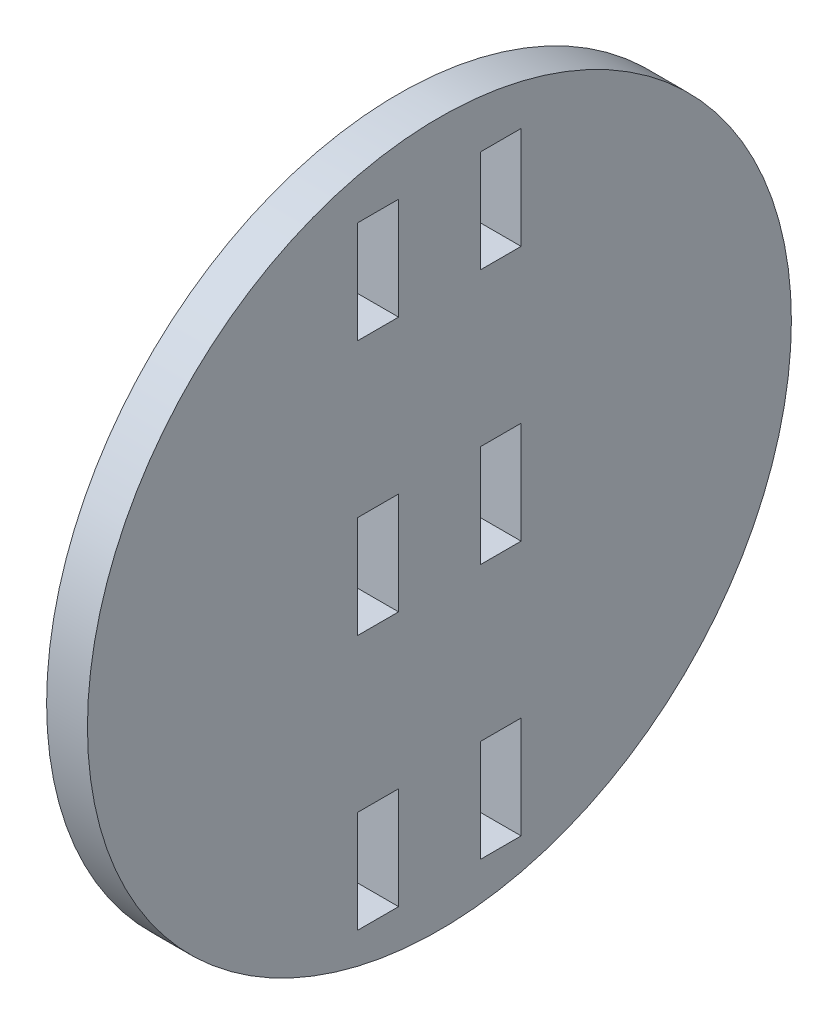
ISO-10303-21;
HEADER;
FILE_DESCRIPTION(('STEP AP214'),'2;1');
FILE_NAME('part.step','',(''),(''),'','','');
FILE_SCHEMA(('AUTOMOTIVE_DESIGN { 1 0 10303 214 1 1 1 1 }'));
ENDSEC;
DATA;
#1=APPLICATION_CONTEXT('core data for automotive mechanical design processes');
#2=APPLICATION_PROTOCOL_DEFINITION('international standard','automotive_design',2000,#1);
#3=PRODUCT_CONTEXT('',#1,'mechanical');
#4=PRODUCT('Part','Part','',(#3));
#5=PRODUCT_RELATED_PRODUCT_CATEGORY('part','',(#4));
#6=PRODUCT_DEFINITION_FORMATION('','',#4);
#7=PRODUCT_DEFINITION_CONTEXT('part definition',#1,'design');
#8=PRODUCT_DEFINITION('design','',#6,#7);
#9=PRODUCT_DEFINITION_SHAPE('','',#8);
#10=(LENGTH_UNIT() NAMED_UNIT(*) SI_UNIT(.MILLI.,.METRE.));
#11=(NAMED_UNIT(*) PLANE_ANGLE_UNIT() SI_UNIT($,.RADIAN.));
#12=(NAMED_UNIT(*) SI_UNIT($,.STERADIAN.) SOLID_ANGLE_UNIT());
#13=UNCERTAINTY_MEASURE_WITH_UNIT(LENGTH_MEASURE(1.E-05),#10,'distance_accuracy_value','');
#14=(GEOMETRIC_REPRESENTATION_CONTEXT(3) GLOBAL_UNCERTAINTY_ASSIGNED_CONTEXT((#13)) GLOBAL_UNIT_ASSIGNED_CONTEXT((#10,
#11,#12)) REPRESENTATION_CONTEXT('',''));
#15=CARTESIAN_POINT('',(0.,0.,0.));
#16=DIRECTION('',(0.,0.,1.));
#17=DIRECTION('',(1.,0.,0.));
#18=AXIS2_PLACEMENT_3D('',#15,#16,#17);
#19=CARTESIAN_POINT('',(2.,0.,0.));
#20=DIRECTION('',(1.,0.,0.));
#21=DIRECTION('',(0.,0.,-1.));
#22=AXIS2_PLACEMENT_3D('',#19,#20,#21);
#23=PLANE('',#22);
#24=DIRECTION('',(0.,1.,0.));
#25=VECTOR('',#24,1.);
#26=CARTESIAN_POINT('',(2.,29.5294117647059,-8.));
#27=LINE('',#26,#25);
#28=CARTESIAN_POINT('',(2.,19.5294117647059,-8.));
#29=VERTEX_POINT('',#28);
#30=CARTESIAN_POINT('',(2.,29.5294117647059,-8.));
#31=VERTEX_POINT('',#30);
#32=EDGE_CURVE('E312',#29,#31,#27,.T.);
#33=ORIENTED_EDGE('',*,*,#32,.F.);
#34=DIRECTION('',(0.,0.,-1.));
#35=VECTOR('',#34,1.);
#36=CARTESIAN_POINT('',(2.,19.5294117647059,-8.));
#37=LINE('',#36,#35);
#38=CARTESIAN_POINT('',(2.,19.5294117647059,-4.));
#39=VERTEX_POINT('',#38);
#40=EDGE_CURVE('E302',#39,#29,#37,.T.);
#41=ORIENTED_EDGE('',*,*,#40,.F.);
#42=DIRECTION('',(0.,-1.,0.));
#43=VECTOR('',#42,1.);
#44=CARTESIAN_POINT('',(2.,29.5294117647059,-4.));
#45=LINE('',#44,#43);
#46=CARTESIAN_POINT('',(2.,29.5294117647059,-4.));
#47=VERTEX_POINT('',#46);
#48=EDGE_CURVE('E318',#47,#39,#45,.T.);
#49=ORIENTED_EDGE('',*,*,#48,.F.);
#50=DIRECTION('',(0.,0.,1.));
#51=VECTOR('',#50,1.);
#52=CARTESIAN_POINT('',(2.,29.5294117647059,-8.));
#53=LINE('',#52,#51);
#54=EDGE_CURVE('E314',#31,#47,#53,.T.);
#55=ORIENTED_EDGE('',*,*,#54,.F.);
#56=EDGE_LOOP('',(#33,#41,#49,#55));
#57=FACE_BOUND('',#56,.T.);
#58=DIRECTION('',(0.,0.,1.));
#59=VECTOR('',#58,1.);
#60=CARTESIAN_POINT('',(2.,4.5294117647059,-8.00000000000026));
#61=LINE('',#60,#59);
#62=CARTESIAN_POINT('',(2.,4.5294117647059,-8.00000000000026));
#63=VERTEX_POINT('',#62);
#64=CARTESIAN_POINT('',(2.,4.5294117647059,-4.00000000000026));
#65=VERTEX_POINT('',#64);
#66=EDGE_CURVE('E315',#63,#65,#61,.T.);
#67=ORIENTED_EDGE('',*,*,#66,.F.);
#68=DIRECTION('',(0.,1.,0.));
#69=VECTOR('',#68,1.);
#70=CARTESIAN_POINT('',(2.,4.5294117647059,-8.00000000000026));
#71=LINE('',#70,#69);
#72=CARTESIAN_POINT('',(2.,-5.4705882352941,-8.00000000000026));
#73=VERTEX_POINT('',#72);
#74=EDGE_CURVE('E342',#73,#63,#71,.T.);
#75=ORIENTED_EDGE('',*,*,#74,.F.);
#76=DIRECTION('',(0.,0.,-1.));
#77=VECTOR('',#76,1.);
#78=CARTESIAN_POINT('',(2.,-5.4705882352941,-8.00000000000026));
#79=LINE('',#78,#77);
#80=CARTESIAN_POINT('',(2.,-5.4705882352941,-4.00000000000026));
#81=VERTEX_POINT('',#80);
#82=EDGE_CURVE('E345',#81,#73,#79,.T.);
#83=ORIENTED_EDGE('',*,*,#82,.F.);
#84=DIRECTION('',(0.,-1.,0.));
#85=VECTOR('',#84,1.);
#86=CARTESIAN_POINT('',(2.,4.5294117647059,-4.00000000000026));
#87=LINE('',#86,#85);
#88=EDGE_CURVE('E349',#65,#81,#87,.T.);
#89=ORIENTED_EDGE('',*,*,#88,.F.);
#90=EDGE_LOOP('',(#67,#75,#83,#89));
#91=FACE_BOUND('',#90,.T.);
#92=DIRECTION('',(0.,0.,1.));
#93=VECTOR('',#92,1.);
#94=CARTESIAN_POINT('',(2.,-20.4705882352941,-8.00000000000052));
#95=LINE('',#94,#93);
#96=CARTESIAN_POINT('',(2.,-20.4705882352941,-8.00000000000052));
#97=VERTEX_POINT('',#96);
#98=CARTESIAN_POINT('',(2.,-20.4705882352941,-4.00000000000052));
#99=VERTEX_POINT('',#98);
#100=EDGE_CURVE('E341',#97,#99,#95,.T.);
#101=ORIENTED_EDGE('',*,*,#100,.F.);
#102=DIRECTION('',(0.,1.,0.));
#103=VECTOR('',#102,1.);
#104=CARTESIAN_POINT('',(2.,-20.4705882352941,-8.00000000000052));
#105=LINE('',#104,#103);
#106=CARTESIAN_POINT('',(2.,-30.4705882352941,-7.99999999999999));
#107=VERTEX_POINT('',#106);
#108=EDGE_CURVE('E372',#107,#97,#105,.T.);
#109=ORIENTED_EDGE('',*,*,#108,.F.);
#110=DIRECTION('',(0.,0.,-1.));
#111=VECTOR('',#110,1.);
#112=CARTESIAN_POINT('',(2.,-30.4705882352941,-7.99999999999999));
#113=LINE('',#112,#111);
#114=CARTESIAN_POINT('',(2.,-30.4705882352941,-3.99999999999999));
#115=VERTEX_POINT('',#114);
#116=EDGE_CURVE('E375',#115,#107,#113,.T.);
#117=ORIENTED_EDGE('',*,*,#116,.F.);
#118=DIRECTION('',(0.,-1.,0.));
#119=VECTOR('',#118,1.);
#120=CARTESIAN_POINT('',(2.,-20.4705882352941,-4.00000000000052));
#121=LINE('',#120,#119);
#122=EDGE_CURVE('E379',#99,#115,#121,.T.);
#123=ORIENTED_EDGE('',*,*,#122,.F.);
#124=EDGE_LOOP('',(#101,#109,#117,#123));
#125=FACE_BOUND('',#124,.T.);
#126=CARTESIAN_POINT('',(2.,0.,0.));
#127=DIRECTION('',(1.,0.,0.));
#128=DIRECTION('',(0.,0.,-1.));
#129=AXIS2_PLACEMENT_3D('',#126,#127,#128);
#130=CIRCLE('',#129,34.4705882352941);
#131=CARTESIAN_POINT('',(2.,0.,-34.4705882352941));
#132=VERTEX_POINT('',#131);
#133=EDGE_CURVE('E11',#132,#132,#130,.T.);
#134=ORIENTED_EDGE('',*,*,#133,.T.);
#135=EDGE_LOOP('',(#134));
#136=FACE_BOUND('',#135,.T.);
#137=DIRECTION('',(0.,1.,0.));
#138=VECTOR('',#137,1.);
#139=CARTESIAN_POINT('',(2.,-20.4705882352941,8.00000000000052));
#140=LINE('',#139,#138);
#141=CARTESIAN_POINT('',(2.,-30.4705882352941,7.99999999999999));
#142=VERTEX_POINT('',#141);
#143=CARTESIAN_POINT('',(2.,-20.4705882352941,8.00000000000052));
#144=VERTEX_POINT('',#143);
#145=EDGE_CURVE('E282',#142,#144,#140,.T.);
#146=ORIENTED_EDGE('',*,*,#145,.T.);
#147=DIRECTION('',(0.,0.,-1.));
#148=VECTOR('',#147,1.);
#149=CARTESIAN_POINT('',(2.,-20.4705882352941,8.00000000000052));
#150=LINE('',#149,#148);
#151=CARTESIAN_POINT('',(2.,-20.4705882352941,4.00000000000052));
#152=VERTEX_POINT('',#151);
#153=EDGE_CURVE('E279',#144,#152,#150,.T.);
#154=ORIENTED_EDGE('',*,*,#153,.T.);
#155=DIRECTION('',(0.,-1.,0.));
#156=VECTOR('',#155,1.);
#157=CARTESIAN_POINT('',(2.,-20.4705882352941,4.00000000000052));
#158=LINE('',#157,#156);
#159=CARTESIAN_POINT('',(2.,-30.4705882352941,3.99999999999999));
#160=VERTEX_POINT('',#159);
#161=EDGE_CURVE('E271',#152,#160,#158,.T.);
#162=ORIENTED_EDGE('',*,*,#161,.T.);
#163=DIRECTION('',(0.,0.,1.));
#164=VECTOR('',#163,1.);
#165=CARTESIAN_POINT('',(2.,-30.4705882352941,7.99999999999999));
#166=LINE('',#165,#164);
#167=EDGE_CURVE('E285',#160,#142,#166,.T.);
#168=ORIENTED_EDGE('',*,*,#167,.T.);
#169=EDGE_LOOP('',(#146,#154,#162,#168));
#170=FACE_BOUND('',#169,.T.);
#171=DIRECTION('',(0.,1.,0.));
#172=VECTOR('',#171,1.);
#173=CARTESIAN_POINT('',(2.,4.5294117647059,8.00000000000026));
#174=LINE('',#173,#172);
#175=CARTESIAN_POINT('',(2.,-5.4705882352941,8.00000000000026));
#176=VERTEX_POINT('',#175);
#177=CARTESIAN_POINT('',(2.,4.5294117647059,8.00000000000026));
#178=VERTEX_POINT('',#177);
#179=EDGE_CURVE('E253',#176,#178,#174,.T.);
#180=ORIENTED_EDGE('',*,*,#179,.T.);
#181=DIRECTION('',(0.,0.,-1.));
#182=VECTOR('',#181,1.);
#183=CARTESIAN_POINT('',(2.,4.5294117647059,8.00000000000026));
#184=LINE('',#183,#182);
#185=CARTESIAN_POINT('',(2.,4.5294117647059,4.00000000000026));
#186=VERTEX_POINT('',#185);
#187=EDGE_CURVE('E61',#178,#186,#184,.T.);
#188=ORIENTED_EDGE('',*,*,#187,.T.);
#189=DIRECTION('',(0.,-1.,0.));
#190=VECTOR('',#189,1.);
#191=CARTESIAN_POINT('',(2.,4.5294117647059,4.00000000000026));
#192=LINE('',#191,#190);
#193=CARTESIAN_POINT('',(2.,-5.4705882352941,4.00000000000026));
#194=VERTEX_POINT('',#193);
#195=EDGE_CURVE('E244',#186,#194,#192,.T.);
#196=ORIENTED_EDGE('',*,*,#195,.T.);
#197=DIRECTION('',(0.,0.,1.));
#198=VECTOR('',#197,1.);
#199=CARTESIAN_POINT('',(2.,-5.4705882352941,8.00000000000026));
#200=LINE('',#199,#198);
#201=EDGE_CURVE('E257',#194,#176,#200,.T.);
#202=ORIENTED_EDGE('',*,*,#201,.T.);
#203=EDGE_LOOP('',(#180,#188,#196,#202));
#204=FACE_BOUND('',#203,.T.);
#205=DIRECTION('',(0.,0.,1.));
#206=VECTOR('',#205,1.);
#207=CARTESIAN_POINT('',(2.,19.5294117647059,8.));
#208=LINE('',#207,#206);
#209=CARTESIAN_POINT('',(2.,19.5294117647059,4.));
#210=VERTEX_POINT('',#209);
#211=CARTESIAN_POINT('',(2.,19.5294117647059,8.));
#212=VERTEX_POINT('',#211);
#213=EDGE_CURVE('E230',#210,#212,#208,.T.);
#214=ORIENTED_EDGE('',*,*,#213,.T.);
#215=DIRECTION('',(0.,1.,0.));
#216=VECTOR('',#215,1.);
#217=CARTESIAN_POINT('',(2.,29.5294117647059,8.));
#218=LINE('',#217,#216);
#219=CARTESIAN_POINT('',(2.,29.5294117647059,8.));
#220=VERTEX_POINT('',#219);
#221=EDGE_CURVE('E53',#212,#220,#218,.T.);
#222=ORIENTED_EDGE('',*,*,#221,.T.);
#223=DIRECTION('',(0.,0.,-1.));
#224=VECTOR('',#223,1.);
#225=CARTESIAN_POINT('',(2.,29.5294117647059,8.));
#226=LINE('',#225,#224);
#227=CARTESIAN_POINT('',(2.,29.5294117647059,4.));
#228=VERTEX_POINT('',#227);
#229=EDGE_CURVE('E221',#220,#228,#226,.T.);
#230=ORIENTED_EDGE('',*,*,#229,.T.);
#231=DIRECTION('',(0.,-1.,0.));
#232=VECTOR('',#231,1.);
#233=CARTESIAN_POINT('',(2.,29.5294117647059,4.));
#234=LINE('',#233,#232);
#235=EDGE_CURVE('E224',#228,#210,#234,.T.);
#236=ORIENTED_EDGE('',*,*,#235,.T.);
#237=EDGE_LOOP('',(#214,#222,#230,#236));
#238=FACE_BOUND('',#237,.T.);
#239=ADVANCED_FACE('F38',(#57,#91,#125,#136,#170,#204,#238),#23,.T.);
#240=CARTESIAN_POINT('',(-2.,0.,0.));
#241=DIRECTION('',(1.,0.,0.));
#242=DIRECTION('',(0.,0.,-1.));
#243=AXIS2_PLACEMENT_3D('',#240,#241,#242);
#244=PLANE('',#243);
#245=DIRECTION('',(0.,0.,-1.));
#246=VECTOR('',#245,1.);
#247=CARTESIAN_POINT('',(-2.,4.5294117647059,8.00000000000026));
#248=LINE('',#247,#246);
#249=CARTESIAN_POINT('',(-2.,4.5294117647059,8.00000000000026));
#250=VERTEX_POINT('',#249);
#251=CARTESIAN_POINT('',(-2.,4.5294117647059,4.00000000000026));
#252=VERTEX_POINT('',#251);
#253=EDGE_CURVE('E241',#250,#252,#248,.T.);
#254=ORIENTED_EDGE('',*,*,#253,.F.);
#255=DIRECTION('',(0.,1.,0.));
#256=VECTOR('',#255,1.);
#257=CARTESIAN_POINT('',(-2.,4.5294117647059,8.00000000000026));
#258=LINE('',#257,#256);
#259=CARTESIAN_POINT('',(-2.,-5.4705882352941,8.00000000000026));
#260=VERTEX_POINT('',#259);
#261=EDGE_CURVE('E243',#260,#250,#258,.T.);
#262=ORIENTED_EDGE('',*,*,#261,.F.);
#263=DIRECTION('',(0.,0.,1.));
#264=VECTOR('',#263,1.);
#265=CARTESIAN_POINT('',(-2.,-5.4705882352941,8.00000000000026));
#266=LINE('',#265,#264);
#267=CARTESIAN_POINT('',(-2.,-5.4705882352941,4.00000000000026));
#268=VERTEX_POINT('',#267);
#269=EDGE_CURVE('E246',#268,#260,#266,.T.);
#270=ORIENTED_EDGE('',*,*,#269,.F.);
#271=DIRECTION('',(0.,-1.,0.));
#272=VECTOR('',#271,1.);
#273=CARTESIAN_POINT('',(-2.,4.5294117647059,4.00000000000026));
#274=LINE('',#273,#272);
#275=EDGE_CURVE('E249',#252,#268,#274,.T.);
#276=ORIENTED_EDGE('',*,*,#275,.F.);
#277=EDGE_LOOP('',(#254,#262,#270,#276));
#278=FACE_BOUND('',#277,.T.);
#279=CARTESIAN_POINT('',(-2.,0.,0.));
#280=DIRECTION('',(1.,0.,0.));
#281=DIRECTION('',(0.,0.,-1.));
#282=AXIS2_PLACEMENT_3D('',#279,#280,#281);
#283=CIRCLE('',#282,34.4705882352941);
#284=CARTESIAN_POINT('',(-2.,0.,-34.4705882352941));
#285=VERTEX_POINT('',#284);
#286=EDGE_CURVE('E42',#285,#285,#283,.T.);
#287=ORIENTED_EDGE('',*,*,#286,.F.);
#288=EDGE_LOOP('',(#287));
#289=FACE_BOUND('',#288,.T.);
#290=DIRECTION('',(0.,1.,0.));
#291=VECTOR('',#290,1.);
#292=CARTESIAN_POINT('',(-2.,-20.4705882352941,-8.00000000000052));
#293=LINE('',#292,#291);
#294=CARTESIAN_POINT('',(-2.,-30.4705882352941,-7.99999999999999));
#295=VERTEX_POINT('',#294);
#296=CARTESIAN_POINT('',(-2.,-20.4705882352941,-8.00000000000052));
#297=VERTEX_POINT('',#296);
#298=EDGE_CURVE('E366',#295,#297,#293,.T.);
#299=ORIENTED_EDGE('',*,*,#298,.T.);
#300=DIRECTION('',(0.,0.,1.));
#301=VECTOR('',#300,1.);
#302=CARTESIAN_POINT('',(-2.,-20.4705882352941,-8.00000000000052));
#303=LINE('',#302,#301);
#304=CARTESIAN_POINT('',(-2.,-20.4705882352941,-4.00000000000052));
#305=VERTEX_POINT('',#304);
#306=EDGE_CURVE('E376',#297,#305,#303,.T.);
#307=ORIENTED_EDGE('',*,*,#306,.T.);
#308=DIRECTION('',(0.,-1.,0.));
#309=VECTOR('',#308,1.);
#310=CARTESIAN_POINT('',(-2.,-20.4705882352941,-4.00000000000052));
#311=LINE('',#310,#309);
#312=CARTESIAN_POINT('',(-2.,-30.4705882352941,-3.99999999999999));
#313=VERTEX_POINT('',#312);
#314=EDGE_CURVE('E388',#305,#313,#311,.T.);
#315=ORIENTED_EDGE('',*,*,#314,.T.);
#316=DIRECTION('',(0.,0.,-1.));
#317=VECTOR('',#316,1.);
#318=CARTESIAN_POINT('',(-2.,-30.4705882352941,-7.99999999999999));
#319=LINE('',#318,#317);
#320=EDGE_CURVE('E385',#313,#295,#319,.T.);
#321=ORIENTED_EDGE('',*,*,#320,.T.);
#322=EDGE_LOOP('',(#299,#307,#315,#321));
#323=FACE_BOUND('',#322,.T.);
#324=DIRECTION('',(0.,1.,0.));
#325=VECTOR('',#324,1.);
#326=CARTESIAN_POINT('',(-2.,4.5294117647059,-8.00000000000026));
#327=LINE('',#326,#325);
#328=CARTESIAN_POINT('',(-2.,-5.4705882352941,-8.00000000000026));
#329=VERTEX_POINT('',#328);
#330=CARTESIAN_POINT('',(-2.,4.5294117647059,-8.00000000000026));
#331=VERTEX_POINT('',#330);
#332=EDGE_CURVE('E334',#329,#331,#327,.T.);
#333=ORIENTED_EDGE('',*,*,#332,.T.);
#334=DIRECTION('',(0.,0.,1.));
#335=VECTOR('',#334,1.);
#336=CARTESIAN_POINT('',(-2.,4.5294117647059,-8.00000000000026));
#337=LINE('',#336,#335);
#338=CARTESIAN_POINT('',(-2.,4.5294117647059,-4.00000000000026));
#339=VERTEX_POINT('',#338);
#340=EDGE_CURVE('E346',#331,#339,#337,.T.);
#341=ORIENTED_EDGE('',*,*,#340,.T.);
#342=DIRECTION('',(0.,-1.,0.));
#343=VECTOR('',#342,1.);
#344=CARTESIAN_POINT('',(-2.,4.5294117647059,-4.00000000000026));
#345=LINE('',#344,#343);
#346=CARTESIAN_POINT('',(-2.,-5.4705882352941,-4.00000000000026));
#347=VERTEX_POINT('',#346);
#348=EDGE_CURVE('E358',#339,#347,#345,.T.);
#349=ORIENTED_EDGE('',*,*,#348,.T.);
#350=DIRECTION('',(0.,0.,-1.));
#351=VECTOR('',#350,1.);
#352=CARTESIAN_POINT('',(-2.,-5.4705882352941,-8.00000000000026));
#353=LINE('',#352,#351);
#354=EDGE_CURVE('E355',#347,#329,#353,.T.);
#355=ORIENTED_EDGE('',*,*,#354,.T.);
#356=EDGE_LOOP('',(#333,#341,#349,#355));
#357=FACE_BOUND('',#356,.T.);
#358=DIRECTION('',(0.,0.,-1.));
#359=VECTOR('',#358,1.);
#360=CARTESIAN_POINT('',(-2.,19.5294117647059,-8.));
#361=LINE('',#360,#359);
#362=CARTESIAN_POINT('',(-2.,19.5294117647059,-4.));
#363=VERTEX_POINT('',#362);
#364=CARTESIAN_POINT('',(-2.,19.5294117647059,-8.));
#365=VERTEX_POINT('',#364);
#366=EDGE_CURVE('E308',#363,#365,#361,.T.);
#367=ORIENTED_EDGE('',*,*,#366,.T.);
#368=DIRECTION('',(0.,1.,0.));
#369=VECTOR('',#368,1.);
#370=CARTESIAN_POINT('',(-2.,29.5294117647059,-8.));
#371=LINE('',#370,#369);
#372=CARTESIAN_POINT('',(-2.,29.5294117647059,-8.));
#373=VERTEX_POINT('',#372);
#374=EDGE_CURVE('E298',#365,#373,#371,.T.);
#375=ORIENTED_EDGE('',*,*,#374,.T.);
#376=DIRECTION('',(0.,0.,1.));
#377=VECTOR('',#376,1.);
#378=CARTESIAN_POINT('',(-2.,29.5294117647059,-8.));
#379=LINE('',#378,#377);
#380=CARTESIAN_POINT('',(-2.,29.5294117647059,-4.));
#381=VERTEX_POINT('',#380);
#382=EDGE_CURVE('E301',#373,#381,#379,.T.);
#383=ORIENTED_EDGE('',*,*,#382,.T.);
#384=DIRECTION('',(0.,-1.,0.));
#385=VECTOR('',#384,1.);
#386=CARTESIAN_POINT('',(-2.,29.5294117647059,-4.));
#387=LINE('',#386,#385);
#388=EDGE_CURVE('E305',#381,#363,#387,.T.);
#389=ORIENTED_EDGE('',*,*,#388,.T.);
#390=EDGE_LOOP('',(#367,#375,#383,#389));
#391=FACE_BOUND('',#390,.T.);
#392=DIRECTION('',(0.,0.,-1.));
#393=VECTOR('',#392,1.);
#394=CARTESIAN_POINT('',(-2.,-20.4705882352941,8.00000000000052));
#395=LINE('',#394,#393);
#396=CARTESIAN_POINT('',(-2.,-20.4705882352941,8.00000000000052));
#397=VERTEX_POINT('',#396);
#398=CARTESIAN_POINT('',(-2.,-20.4705882352941,4.00000000000052));
#399=VERTEX_POINT('',#398);
#400=EDGE_CURVE('E268',#397,#399,#395,.T.);
#401=ORIENTED_EDGE('',*,*,#400,.F.);
#402=DIRECTION('',(0.,1.,0.));
#403=VECTOR('',#402,1.);
#404=CARTESIAN_POINT('',(-2.,-20.4705882352941,8.00000000000052));
#405=LINE('',#404,#403);
#406=CARTESIAN_POINT('',(-2.,-30.4705882352941,7.99999999999999));
#407=VERTEX_POINT('',#406);
#408=EDGE_CURVE('E270',#407,#397,#405,.T.);
#409=ORIENTED_EDGE('',*,*,#408,.F.);
#410=DIRECTION('',(0.,0.,1.));
#411=VECTOR('',#410,1.);
#412=CARTESIAN_POINT('',(-2.,-30.4705882352941,7.99999999999999));
#413=LINE('',#412,#411);
#414=CARTESIAN_POINT('',(-2.,-30.4705882352941,3.99999999999999));
#415=VERTEX_POINT('',#414);
#416=EDGE_CURVE('E273',#415,#407,#413,.T.);
#417=ORIENTED_EDGE('',*,*,#416,.F.);
#418=DIRECTION('',(0.,-1.,0.));
#419=VECTOR('',#418,1.);
#420=CARTESIAN_POINT('',(-2.,-20.4705882352941,4.00000000000052));
#421=LINE('',#420,#419);
#422=EDGE_CURVE('E276',#399,#415,#421,.T.);
#423=ORIENTED_EDGE('',*,*,#422,.F.);
#424=EDGE_LOOP('',(#401,#409,#417,#423));
#425=FACE_BOUND('',#424,.T.);
#426=DIRECTION('',(0.,1.,0.));
#427=VECTOR('',#426,1.);
#428=CARTESIAN_POINT('',(-2.,29.5294117647059,8.));
#429=LINE('',#428,#427);
#430=CARTESIAN_POINT('',(-2.,19.5294117647059,8.));
#431=VERTEX_POINT('',#430);
#432=CARTESIAN_POINT('',(-2.,29.5294117647059,8.));
#433=VERTEX_POINT('',#432);
#434=EDGE_CURVE('E213',#431,#433,#429,.T.);
#435=ORIENTED_EDGE('',*,*,#434,.F.);
#436=DIRECTION('',(0.,0.,1.));
#437=VECTOR('',#436,1.);
#438=CARTESIAN_POINT('',(-2.,19.5294117647059,8.));
#439=LINE('',#438,#437);
#440=CARTESIAN_POINT('',(-2.,19.5294117647059,4.));
#441=VERTEX_POINT('',#440);
#442=EDGE_CURVE('E202',#441,#431,#439,.T.);
#443=ORIENTED_EDGE('',*,*,#442,.F.);
#444=DIRECTION('',(0.,-1.,0.));
#445=VECTOR('',#444,1.);
#446=CARTESIAN_POINT('',(-2.,29.5294117647059,4.));
#447=LINE('',#446,#445);
#448=CARTESIAN_POINT('',(-2.,29.5294117647059,4.));
#449=VERTEX_POINT('',#448);
#450=EDGE_CURVE('E212',#449,#441,#447,.T.);
#451=ORIENTED_EDGE('',*,*,#450,.F.);
#452=DIRECTION('',(0.,0.,-1.));
#453=VECTOR('',#452,1.);
#454=CARTESIAN_POINT('',(-2.,29.5294117647059,8.));
#455=LINE('',#454,#453);
#456=EDGE_CURVE('E217',#433,#449,#455,.T.);
#457=ORIENTED_EDGE('',*,*,#456,.F.);
#458=EDGE_LOOP('',(#435,#443,#451,#457));
#459=FACE_BOUND('',#458,.T.);
#460=ADVANCED_FACE('F220',(#278,#289,#323,#357,#391,#425,#459),#244,.F.);
#461=CARTESIAN_POINT('',(2.,0.,0.));
#462=DIRECTION('',(-1.,0.,0.));
#463=DIRECTION('',(0.,0.,1.));
#464=AXIS2_PLACEMENT_3D('',#461,#462,#463);
#465=CYLINDRICAL_SURFACE('',#464,34.4705882352941);
#466=ORIENTED_EDGE('',*,*,#133,.F.);
#467=EDGE_LOOP('',(#466));
#468=FACE_BOUND('',#467,.T.);
#469=ORIENTED_EDGE('',*,*,#286,.T.);
#470=EDGE_LOOP('',(#469));
#471=FACE_BOUND('',#470,.T.);
#472=ADVANCED_FACE('F40',(#468,#471),#465,.T.);
#473=CARTESIAN_POINT('',(-2.,-20.4705882352941,-8.00000000000052));
#474=DIRECTION('',(0.,1.,0.));
#475=DIRECTION('',(0.,0.,1.));
#476=AXIS2_PLACEMENT_3D('',#473,#474,#475);
#477=PLANE('',#476);
#478=ORIENTED_EDGE('',*,*,#100,.T.);
#479=DIRECTION('',(1.,0.,0.));
#480=VECTOR('',#479,1.);
#481=CARTESIAN_POINT('',(-2.,-20.4705882352941,-4.00000000000052));
#482=LINE('',#481,#480);
#483=EDGE_CURVE('E363',#305,#99,#482,.T.);
#484=ORIENTED_EDGE('',*,*,#483,.F.);
#485=ORIENTED_EDGE('',*,*,#306,.F.);
#486=DIRECTION('',(1.,0.,0.));
#487=VECTOR('',#486,1.);
#488=CARTESIAN_POINT('',(-2.,-20.4705882352941,-8.00000000000052));
#489=LINE('',#488,#487);
#490=EDGE_CURVE('E237',#297,#97,#489,.T.);
#491=ORIENTED_EDGE('',*,*,#490,.T.);
#492=EDGE_LOOP('',(#478,#484,#485,#491));
#493=FACE_BOUND('',#492,.T.);
#494=ADVANCED_FACE('F398',(#493),#477,.F.);
#495=CARTESIAN_POINT('',(-2.,-20.4705882352941,-8.00000000000052));
#496=DIRECTION('',(0.,0.,-1.));
#497=DIRECTION('',(0.,1.,0.));
#498=AXIS2_PLACEMENT_3D('',#495,#496,#497);
#499=PLANE('',#498);
#500=ORIENTED_EDGE('',*,*,#108,.T.);
#501=ORIENTED_EDGE('',*,*,#490,.F.);
#502=ORIENTED_EDGE('',*,*,#298,.F.);
#503=DIRECTION('',(1.,0.,0.));
#504=VECTOR('',#503,1.);
#505=CARTESIAN_POINT('',(-2.,-30.4705882352941,-7.99999999999999));
#506=LINE('',#505,#504);
#507=EDGE_CURVE('E369',#295,#107,#506,.T.);
#508=ORIENTED_EDGE('',*,*,#507,.T.);
#509=EDGE_LOOP('',(#500,#501,#502,#508));
#510=FACE_BOUND('',#509,.T.);
#511=ADVANCED_FACE('F409',(#510),#499,.F.);
#512=CARTESIAN_POINT('',(-2.,-30.4705882352941,-7.99999999999999));
#513=DIRECTION('',(0.,-1.,0.));
#514=DIRECTION('',(0.,0.,-1.));
#515=AXIS2_PLACEMENT_3D('',#512,#513,#514);
#516=PLANE('',#515);
#517=ORIENTED_EDGE('',*,*,#116,.T.);
#518=ORIENTED_EDGE('',*,*,#507,.F.);
#519=ORIENTED_EDGE('',*,*,#320,.F.);
#520=DIRECTION('',(1.,0.,0.));
#521=VECTOR('',#520,1.);
#522=CARTESIAN_POINT('',(-2.,-30.4705882352941,-3.99999999999999));
#523=LINE('',#522,#521);
#524=EDGE_CURVE('E367',#313,#115,#523,.T.);
#525=ORIENTED_EDGE('',*,*,#524,.T.);
#526=EDGE_LOOP('',(#517,#518,#519,#525));
#527=FACE_BOUND('',#526,.T.);
#528=ADVANCED_FACE('F406',(#527),#516,.F.);
#529=CARTESIAN_POINT('',(-2.,-20.4705882352941,-4.00000000000052));
#530=DIRECTION('',(0.,0.,1.));
#531=DIRECTION('',(0.,-1.,0.));
#532=AXIS2_PLACEMENT_3D('',#529,#530,#531);
#533=PLANE('',#532);
#534=ORIENTED_EDGE('',*,*,#122,.T.);
#535=ORIENTED_EDGE('',*,*,#524,.F.);
#536=ORIENTED_EDGE('',*,*,#314,.F.);
#537=ORIENTED_EDGE('',*,*,#483,.T.);
#538=EDGE_LOOP('',(#534,#535,#536,#537));
#539=FACE_BOUND('',#538,.T.);
#540=ADVANCED_FACE('F403',(#539),#533,.F.);
#541=CARTESIAN_POINT('',(-2.,4.5294117647059,-8.00000000000026));
#542=DIRECTION('',(0.,1.,0.));
#543=DIRECTION('',(0.,0.,1.));
#544=AXIS2_PLACEMENT_3D('',#541,#542,#543);
#545=PLANE('',#544);
#546=ORIENTED_EDGE('',*,*,#66,.T.);
#547=DIRECTION('',(1.,0.,0.));
#548=VECTOR('',#547,1.);
#549=CARTESIAN_POINT('',(-2.,4.5294117647059,-4.00000000000026));
#550=LINE('',#549,#548);
#551=EDGE_CURVE('E331',#339,#65,#550,.T.);
#552=ORIENTED_EDGE('',*,*,#551,.F.);
#553=ORIENTED_EDGE('',*,*,#340,.F.);
#554=DIRECTION('',(1.,0.,0.));
#555=VECTOR('',#554,1.);
#556=CARTESIAN_POINT('',(-2.,4.5294117647059,-8.00000000000026));
#557=LINE('',#556,#555);
#558=EDGE_CURVE('E339',#331,#63,#557,.T.);
#559=ORIENTED_EDGE('',*,*,#558,.T.);
#560=EDGE_LOOP('',(#546,#552,#553,#559));
#561=FACE_BOUND('',#560,.T.);
#562=ADVANCED_FACE('F486',(#561),#545,.F.);
#563=CARTESIAN_POINT('',(-2.,4.5294117647059,-8.00000000000026));
#564=DIRECTION('',(0.,0.,-1.));
#565=DIRECTION('',(0.,1.,0.));
#566=AXIS2_PLACEMENT_3D('',#563,#564,#565);
#567=PLANE('',#566);
#568=ORIENTED_EDGE('',*,*,#74,.T.);
#569=ORIENTED_EDGE('',*,*,#558,.F.);
#570=ORIENTED_EDGE('',*,*,#332,.F.);
#571=DIRECTION('',(1.,0.,0.));
#572=VECTOR('',#571,1.);
#573=CARTESIAN_POINT('',(-2.,-5.4705882352941,-8.00000000000026));
#574=LINE('',#573,#572);
#575=EDGE_CURVE('E337',#329,#73,#574,.T.);
#576=ORIENTED_EDGE('',*,*,#575,.T.);
#577=EDGE_LOOP('',(#568,#569,#570,#576));
#578=FACE_BOUND('',#577,.T.);
#579=ADVANCED_FACE('F489',(#578),#567,.F.);
#580=CARTESIAN_POINT('',(-2.,-5.4705882352941,-8.00000000000026));
#581=DIRECTION('',(0.,-1.,0.));
#582=DIRECTION('',(0.,0.,-1.));
#583=AXIS2_PLACEMENT_3D('',#580,#581,#582);
#584=PLANE('',#583);
#585=ORIENTED_EDGE('',*,*,#82,.T.);
#586=ORIENTED_EDGE('',*,*,#575,.F.);
#587=ORIENTED_EDGE('',*,*,#354,.F.);
#588=DIRECTION('',(1.,0.,0.));
#589=VECTOR('',#588,1.);
#590=CARTESIAN_POINT('',(-2.,-5.4705882352941,-4.00000000000026));
#591=LINE('',#590,#589);
#592=EDGE_CURVE('E335',#347,#81,#591,.T.);
#593=ORIENTED_EDGE('',*,*,#592,.T.);
#594=EDGE_LOOP('',(#585,#586,#587,#593));
#595=FACE_BOUND('',#594,.T.);
#596=ADVANCED_FACE('F493',(#595),#584,.F.);
#597=CARTESIAN_POINT('',(-2.,4.5294117647059,-4.00000000000026));
#598=DIRECTION('',(0.,0.,1.));
#599=DIRECTION('',(0.,-1.,0.));
#600=AXIS2_PLACEMENT_3D('',#597,#598,#599);
#601=PLANE('',#600);
#602=ORIENTED_EDGE('',*,*,#88,.T.);
#603=ORIENTED_EDGE('',*,*,#592,.F.);
#604=ORIENTED_EDGE('',*,*,#348,.F.);
#605=ORIENTED_EDGE('',*,*,#551,.T.);
#606=EDGE_LOOP('',(#602,#603,#604,#605));
#607=FACE_BOUND('',#606,.T.);
#608=ADVANCED_FACE('F484',(#607),#601,.F.);
#609=CARTESIAN_POINT('',(-2.,29.5294117647059,-8.));
#610=DIRECTION('',(0.,0.,-1.));
#611=DIRECTION('',(0.,1.,0.));
#612=AXIS2_PLACEMENT_3D('',#609,#610,#611);
#613=PLANE('',#612);
#614=ORIENTED_EDGE('',*,*,#32,.T.);
#615=DIRECTION('',(1.,0.,0.));
#616=VECTOR('',#615,1.);
#617=CARTESIAN_POINT('',(-2.,29.5294117647059,-8.));
#618=LINE('',#617,#616);
#619=EDGE_CURVE('E311',#373,#31,#618,.T.);
#620=ORIENTED_EDGE('',*,*,#619,.F.);
#621=ORIENTED_EDGE('',*,*,#374,.F.);
#622=DIRECTION('',(1.,0.,0.));
#623=VECTOR('',#622,1.);
#624=CARTESIAN_POINT('',(-2.,19.5294117647059,-8.));
#625=LINE('',#624,#623);
#626=EDGE_CURVE('E323',#365,#29,#625,.T.);
#627=ORIENTED_EDGE('',*,*,#626,.T.);
#628=EDGE_LOOP('',(#614,#620,#621,#627));
#629=FACE_BOUND('',#628,.T.);
#630=ADVANCED_FACE('F474',(#629),#613,.F.);
#631=CARTESIAN_POINT('',(-2.,19.5294117647059,-8.));
#632=DIRECTION('',(0.,-1.,0.));
#633=DIRECTION('',(0.,0.,-1.));
#634=AXIS2_PLACEMENT_3D('',#631,#632,#633);
#635=PLANE('',#634);
#636=ORIENTED_EDGE('',*,*,#40,.T.);
#637=ORIENTED_EDGE('',*,*,#626,.F.);
#638=ORIENTED_EDGE('',*,*,#366,.F.);
#639=DIRECTION('',(1.,0.,0.));
#640=VECTOR('',#639,1.);
#641=CARTESIAN_POINT('',(-2.,19.5294117647059,-4.));
#642=LINE('',#641,#640);
#643=EDGE_CURVE('E325',#363,#39,#642,.T.);
#644=ORIENTED_EDGE('',*,*,#643,.T.);
#645=EDGE_LOOP('',(#636,#637,#638,#644));
#646=FACE_BOUND('',#645,.T.);
#647=ADVANCED_FACE('F470',(#646),#635,.F.);
#648=CARTESIAN_POINT('',(-2.,29.5294117647059,-4.));
#649=DIRECTION('',(0.,0.,1.));
#650=DIRECTION('',(0.,-1.,0.));
#651=AXIS2_PLACEMENT_3D('',#648,#649,#650);
#652=PLANE('',#651);
#653=ORIENTED_EDGE('',*,*,#48,.T.);
#654=ORIENTED_EDGE('',*,*,#643,.F.);
#655=ORIENTED_EDGE('',*,*,#388,.F.);
#656=DIRECTION('',(1.,0.,0.));
#657=VECTOR('',#656,1.);
#658=CARTESIAN_POINT('',(-2.,29.5294117647059,-4.));
#659=LINE('',#658,#657);
#660=EDGE_CURVE('E327',#381,#47,#659,.T.);
#661=ORIENTED_EDGE('',*,*,#660,.T.);
#662=EDGE_LOOP('',(#653,#654,#655,#661));
#663=FACE_BOUND('',#662,.T.);
#664=ADVANCED_FACE('F473',(#663),#652,.F.);
#665=CARTESIAN_POINT('',(-2.,29.5294117647059,-8.));
#666=DIRECTION('',(0.,1.,0.));
#667=DIRECTION('',(0.,0.,1.));
#668=AXIS2_PLACEMENT_3D('',#665,#666,#667);
#669=PLANE('',#668);
#670=ORIENTED_EDGE('',*,*,#54,.T.);
#671=ORIENTED_EDGE('',*,*,#660,.F.);
#672=ORIENTED_EDGE('',*,*,#382,.F.);
#673=ORIENTED_EDGE('',*,*,#619,.T.);
#674=EDGE_LOOP('',(#670,#671,#672,#673));
#675=FACE_BOUND('',#674,.T.);
#676=ADVANCED_FACE('F468',(#675),#669,.F.);
#677=CARTESIAN_POINT('',(-2.,-20.4705882352941,8.00000000000052));
#678=DIRECTION('',(0.,-1.,0.));
#679=DIRECTION('',(0.,0.,-1.));
#680=AXIS2_PLACEMENT_3D('',#677,#678,#679);
#681=PLANE('',#680);
#682=ORIENTED_EDGE('',*,*,#153,.F.);
#683=DIRECTION('',(1.,0.,0.));
#684=VECTOR('',#683,1.);
#685=CARTESIAN_POINT('',(-2.,-20.4705882352941,8.00000000000052));
#686=LINE('',#685,#684);
#687=EDGE_CURVE('E278',#397,#144,#686,.T.);
#688=ORIENTED_EDGE('',*,*,#687,.F.);
#689=ORIENTED_EDGE('',*,*,#400,.T.);
#690=DIRECTION('',(1.,0.,0.));
#691=VECTOR('',#690,1.);
#692=CARTESIAN_POINT('',(-2.,-20.4705882352941,4.00000000000052));
#693=LINE('',#692,#691);
#694=EDGE_CURVE('E254',#399,#152,#693,.T.);
#695=ORIENTED_EDGE('',*,*,#694,.T.);
#696=EDGE_LOOP('',(#682,#688,#689,#695));
#697=FACE_BOUND('',#696,.T.);
#698=ADVANCED_FACE('F458',(#697),#681,.T.);
#699=CARTESIAN_POINT('',(-2.,-20.4705882352941,4.00000000000052));
#700=DIRECTION('',(0.,0.,1.));
#701=DIRECTION('',(0.,-1.,0.));
#702=AXIS2_PLACEMENT_3D('',#699,#700,#701);
#703=PLANE('',#702);
#704=ORIENTED_EDGE('',*,*,#161,.F.);
#705=ORIENTED_EDGE('',*,*,#694,.F.);
#706=ORIENTED_EDGE('',*,*,#422,.T.);
#707=DIRECTION('',(1.,0.,0.));
#708=VECTOR('',#707,1.);
#709=CARTESIAN_POINT('',(-2.,-30.4705882352941,3.99999999999999));
#710=LINE('',#709,#708);
#711=EDGE_CURVE('E292',#415,#160,#710,.T.);
#712=ORIENTED_EDGE('',*,*,#711,.T.);
#713=EDGE_LOOP('',(#704,#705,#706,#712));
#714=FACE_BOUND('',#713,.T.);
#715=ADVANCED_FACE('F454',(#714),#703,.T.);
#716=CARTESIAN_POINT('',(-2.,-30.4705882352941,7.99999999999999));
#717=DIRECTION('',(0.,1.,0.));
#718=DIRECTION('',(0.,0.,1.));
#719=AXIS2_PLACEMENT_3D('',#716,#717,#718);
#720=PLANE('',#719);
#721=ORIENTED_EDGE('',*,*,#167,.F.);
#722=ORIENTED_EDGE('',*,*,#711,.F.);
#723=ORIENTED_EDGE('',*,*,#416,.T.);
#724=DIRECTION('',(1.,0.,0.));
#725=VECTOR('',#724,1.);
#726=CARTESIAN_POINT('',(-2.,-30.4705882352941,7.99999999999999));
#727=LINE('',#726,#725);
#728=EDGE_CURVE('E294',#407,#142,#727,.T.);
#729=ORIENTED_EDGE('',*,*,#728,.T.);
#730=EDGE_LOOP('',(#721,#722,#723,#729));
#731=FACE_BOUND('',#730,.T.);
#732=ADVANCED_FACE('F457',(#731),#720,.T.);
#733=CARTESIAN_POINT('',(-2.,-20.4705882352941,8.00000000000052));
#734=DIRECTION('',(0.,0.,-1.));
#735=DIRECTION('',(0.,1.,0.));
#736=AXIS2_PLACEMENT_3D('',#733,#734,#735);
#737=PLANE('',#736);
#738=ORIENTED_EDGE('',*,*,#145,.F.);
#739=ORIENTED_EDGE('',*,*,#728,.F.);
#740=ORIENTED_EDGE('',*,*,#408,.T.);
#741=ORIENTED_EDGE('',*,*,#687,.T.);
#742=EDGE_LOOP('',(#738,#739,#740,#741));
#743=FACE_BOUND('',#742,.T.);
#744=ADVANCED_FACE('F453',(#743),#737,.T.);
#745=CARTESIAN_POINT('',(-2.,4.5294117647059,8.00000000000026));
#746=DIRECTION('',(0.,-1.,0.));
#747=DIRECTION('',(0.,0.,-1.));
#748=AXIS2_PLACEMENT_3D('',#745,#746,#747);
#749=PLANE('',#748);
#750=ORIENTED_EDGE('',*,*,#187,.F.);
#751=DIRECTION('',(1.,0.,0.));
#752=VECTOR('',#751,1.);
#753=CARTESIAN_POINT('',(-2.,4.5294117647059,8.00000000000026));
#754=LINE('',#753,#752);
#755=EDGE_CURVE('E251',#250,#178,#754,.T.);
#756=ORIENTED_EDGE('',*,*,#755,.F.);
#757=ORIENTED_EDGE('',*,*,#253,.T.);
#758=DIRECTION('',(1.,0.,0.));
#759=VECTOR('',#758,1.);
#760=CARTESIAN_POINT('',(-2.,4.5294117647059,4.00000000000026));
#761=LINE('',#760,#759);
#762=EDGE_CURVE('E231',#252,#186,#761,.T.);
#763=ORIENTED_EDGE('',*,*,#762,.T.);
#764=EDGE_LOOP('',(#750,#756,#757,#763));
#765=FACE_BOUND('',#764,.T.);
#766=ADVANCED_FACE('F443',(#765),#749,.T.);
#767=CARTESIAN_POINT('',(-2.,4.5294117647059,4.00000000000026));
#768=DIRECTION('',(0.,0.,1.));
#769=DIRECTION('',(0.,-1.,0.));
#770=AXIS2_PLACEMENT_3D('',#767,#768,#769);
#771=PLANE('',#770);
#772=ORIENTED_EDGE('',*,*,#195,.F.);
#773=ORIENTED_EDGE('',*,*,#762,.F.);
#774=ORIENTED_EDGE('',*,*,#275,.T.);
#775=DIRECTION('',(1.,0.,0.));
#776=VECTOR('',#775,1.);
#777=CARTESIAN_POINT('',(-2.,-5.4705882352941,4.00000000000026));
#778=LINE('',#777,#776);
#779=EDGE_CURVE('E263',#268,#194,#778,.T.);
#780=ORIENTED_EDGE('',*,*,#779,.T.);
#781=EDGE_LOOP('',(#772,#773,#774,#780));
#782=FACE_BOUND('',#781,.T.);
#783=ADVANCED_FACE('F439',(#782),#771,.T.);
#784=CARTESIAN_POINT('',(-2.,-5.4705882352941,8.00000000000026));
#785=DIRECTION('',(0.,1.,0.));
#786=DIRECTION('',(0.,0.,1.));
#787=AXIS2_PLACEMENT_3D('',#784,#785,#786);
#788=PLANE('',#787);
#789=ORIENTED_EDGE('',*,*,#201,.F.);
#790=ORIENTED_EDGE('',*,*,#779,.F.);
#791=ORIENTED_EDGE('',*,*,#269,.T.);
#792=DIRECTION('',(1.,0.,0.));
#793=VECTOR('',#792,1.);
#794=CARTESIAN_POINT('',(-2.,-5.4705882352941,8.00000000000026));
#795=LINE('',#794,#793);
#796=EDGE_CURVE('E265',#260,#176,#795,.T.);
#797=ORIENTED_EDGE('',*,*,#796,.T.);
#798=EDGE_LOOP('',(#789,#790,#791,#797));
#799=FACE_BOUND('',#798,.T.);
#800=ADVANCED_FACE('F442',(#799),#788,.T.);
#801=CARTESIAN_POINT('',(-2.,4.5294117647059,8.00000000000026));
#802=DIRECTION('',(0.,0.,-1.));
#803=DIRECTION('',(0.,1.,0.));
#804=AXIS2_PLACEMENT_3D('',#801,#802,#803);
#805=PLANE('',#804);
#806=ORIENTED_EDGE('',*,*,#179,.F.);
#807=ORIENTED_EDGE('',*,*,#796,.F.);
#808=ORIENTED_EDGE('',*,*,#261,.T.);
#809=ORIENTED_EDGE('',*,*,#755,.T.);
#810=EDGE_LOOP('',(#806,#807,#808,#809));
#811=FACE_BOUND('',#810,.T.);
#812=ADVANCED_FACE('F434',(#811),#805,.T.);
#813=CARTESIAN_POINT('',(-2.,29.5294117647059,8.));
#814=DIRECTION('',(0.,0.,-1.));
#815=DIRECTION('',(0.,1.,0.));
#816=AXIS2_PLACEMENT_3D('',#813,#814,#815);
#817=PLANE('',#816);
#818=ORIENTED_EDGE('',*,*,#221,.F.);
#819=DIRECTION('',(1.,0.,0.));
#820=VECTOR('',#819,1.);
#821=CARTESIAN_POINT('',(-2.,19.5294117647059,8.));
#822=LINE('',#821,#820);
#823=EDGE_CURVE('E205',#431,#212,#822,.T.);
#824=ORIENTED_EDGE('',*,*,#823,.F.);
#825=ORIENTED_EDGE('',*,*,#434,.T.);
#826=DIRECTION('',(1.,0.,0.));
#827=VECTOR('',#826,1.);
#828=CARTESIAN_POINT('',(-2.,29.5294117647059,8.));
#829=LINE('',#828,#827);
#830=EDGE_CURVE('E235',#433,#220,#829,.T.);
#831=ORIENTED_EDGE('',*,*,#830,.T.);
#832=EDGE_LOOP('',(#818,#824,#825,#831));
#833=FACE_BOUND('',#832,.T.);
#834=ADVANCED_FACE('F215',(#833),#817,.T.);
#835=CARTESIAN_POINT('',(-2.,29.5294117647059,8.));
#836=DIRECTION('',(0.,-1.,0.));
#837=DIRECTION('',(0.,0.,-1.));
#838=AXIS2_PLACEMENT_3D('',#835,#836,#837);
#839=PLANE('',#838);
#840=ORIENTED_EDGE('',*,*,#229,.F.);
#841=ORIENTED_EDGE('',*,*,#830,.F.);
#842=ORIENTED_EDGE('',*,*,#456,.T.);
#843=DIRECTION('',(1.,0.,0.));
#844=VECTOR('',#843,1.);
#845=CARTESIAN_POINT('',(-2.,29.5294117647059,4.));
#846=LINE('',#845,#844);
#847=EDGE_CURVE('E238',#449,#228,#846,.T.);
#848=ORIENTED_EDGE('',*,*,#847,.T.);
#849=EDGE_LOOP('',(#840,#841,#842,#848));
#850=FACE_BOUND('',#849,.T.);
#851=ADVANCED_FACE('F426',(#850),#839,.T.);
#852=CARTESIAN_POINT('',(-2.,29.5294117647059,4.));
#853=DIRECTION('',(0.,0.,1.));
#854=DIRECTION('',(0.,-1.,0.));
#855=AXIS2_PLACEMENT_3D('',#852,#853,#854);
#856=PLANE('',#855);
#857=ORIENTED_EDGE('',*,*,#235,.F.);
#858=ORIENTED_EDGE('',*,*,#847,.F.);
#859=ORIENTED_EDGE('',*,*,#450,.T.);
#860=DIRECTION('',(1.,0.,0.));
#861=VECTOR('',#860,1.);
#862=CARTESIAN_POINT('',(-2.,19.5294117647059,4.));
#863=LINE('',#862,#861);
#864=EDGE_CURVE('E207',#441,#210,#863,.T.);
#865=ORIENTED_EDGE('',*,*,#864,.T.);
#866=EDGE_LOOP('',(#857,#858,#859,#865));
#867=FACE_BOUND('',#866,.T.);
#868=ADVANCED_FACE('F424',(#867),#856,.T.);
#869=CARTESIAN_POINT('',(-2.,19.5294117647059,8.));
#870=DIRECTION('',(0.,1.,0.));
#871=DIRECTION('',(0.,0.,1.));
#872=AXIS2_PLACEMENT_3D('',#869,#870,#871);
#873=PLANE('',#872);
#874=ORIENTED_EDGE('',*,*,#213,.F.);
#875=ORIENTED_EDGE('',*,*,#864,.F.);
#876=ORIENTED_EDGE('',*,*,#442,.T.);
#877=ORIENTED_EDGE('',*,*,#823,.T.);
#878=EDGE_LOOP('',(#874,#875,#876,#877));
#879=FACE_BOUND('',#878,.T.);
#880=ADVANCED_FACE('F204',(#879),#873,.T.);
#881=CLOSED_SHELL('',(#239,#460,#472,#494,#511,#528,#540,#562,#579,#596,#608,#630,#647,#664,
#676,#698,#715,#732,#744,#766,#783,#800,#812,#834,#851,#868,#880));
#882=MANIFOLD_SOLID_BREP('B2',#881);
#883=ADVANCED_BREP_SHAPE_REPRESENTATION('',(#18,#882),#14);
#884=SHAPE_DEFINITION_REPRESENTATION(#9,#883);
ENDSEC;
END-ISO-10303-21;
